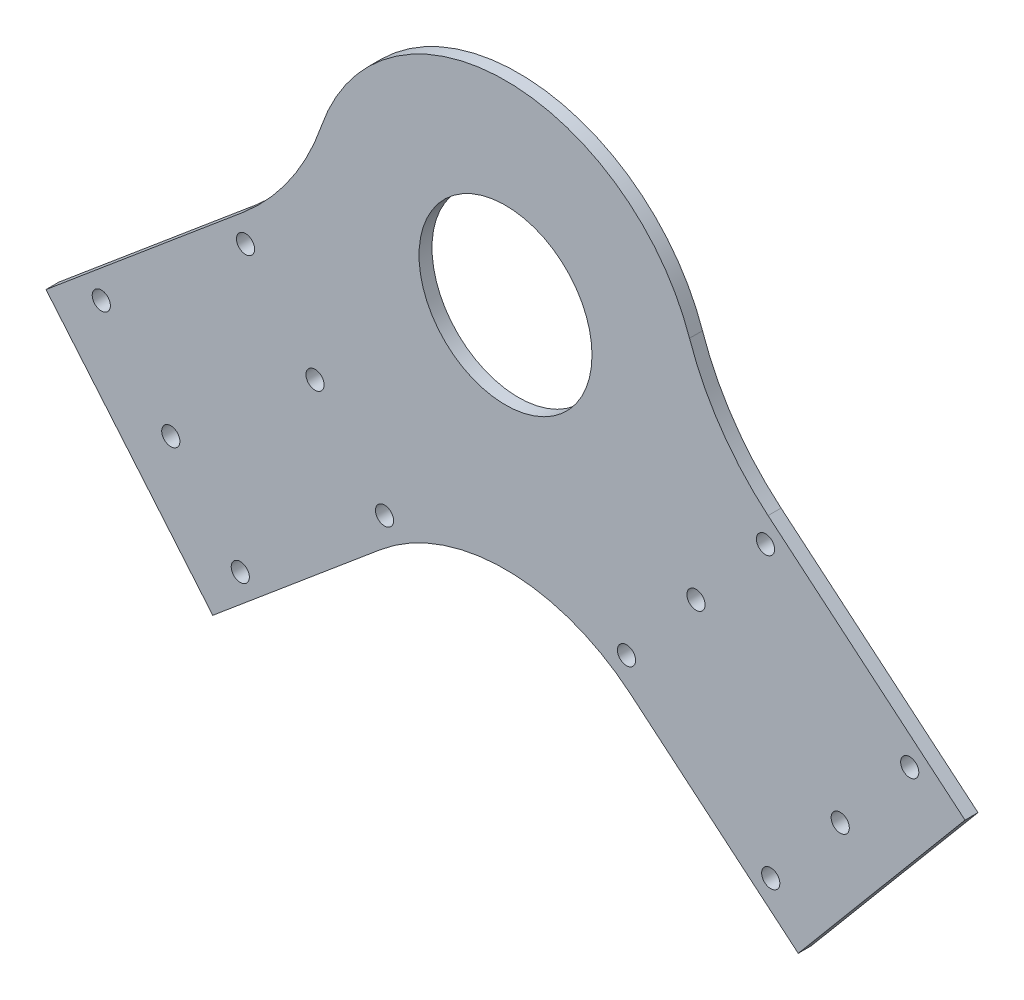
ISO-10303-21;
HEADER;
FILE_DESCRIPTION(('STEP AP214'),'2;1');
FILE_NAME('part.step','',(''),(''),'','','');
FILE_SCHEMA(('AUTOMOTIVE_DESIGN { 1 0 10303 214 1 1 1 1 }'));
ENDSEC;
DATA;
#1=APPLICATION_CONTEXT('core data for automotive mechanical design processes');
#2=APPLICATION_PROTOCOL_DEFINITION('international standard','automotive_design',2000,#1);
#3=PRODUCT_CONTEXT('',#1,'mechanical');
#4=PRODUCT('Part','Part','',(#3));
#5=PRODUCT_RELATED_PRODUCT_CATEGORY('part','',(#4));
#6=PRODUCT_DEFINITION_FORMATION('','',#4);
#7=PRODUCT_DEFINITION_CONTEXT('part definition',#1,'design');
#8=PRODUCT_DEFINITION('design','',#6,#7);
#9=PRODUCT_DEFINITION_SHAPE('','',#8);
#10=(LENGTH_UNIT() NAMED_UNIT(*) SI_UNIT(.MILLI.,.METRE.));
#11=(NAMED_UNIT(*) PLANE_ANGLE_UNIT() SI_UNIT($,.RADIAN.));
#12=(NAMED_UNIT(*) SI_UNIT($,.STERADIAN.) SOLID_ANGLE_UNIT());
#13=UNCERTAINTY_MEASURE_WITH_UNIT(LENGTH_MEASURE(1.E-05),#10,'distance_accuracy_value','');
#14=(GEOMETRIC_REPRESENTATION_CONTEXT(3) GLOBAL_UNCERTAINTY_ASSIGNED_CONTEXT((#13)) GLOBAL_UNIT_ASSIGNED_CONTEXT((#10,
#11,#12)) REPRESENTATION_CONTEXT('',''));
#15=CARTESIAN_POINT('',(0.,0.,0.));
#16=DIRECTION('',(0.,0.,1.));
#17=DIRECTION('',(1.,0.,0.));
#18=AXIS2_PLACEMENT_3D('',#15,#16,#17);
#19=CARTESIAN_POINT('',(0.,0.,3.));
#20=DIRECTION('',(0.,0.,-1.));
#21=DIRECTION('',(-1.,0.,0.));
#22=AXIS2_PLACEMENT_3D('',#19,#20,#21);
#23=CYLINDRICAL_SURFACE('',#22,45.);
#24=CARTESIAN_POINT('',(0.,0.,3.));
#25=DIRECTION('',(0.,0.,1.));
#26=DIRECTION('',(1.,0.,0.));
#27=AXIS2_PLACEMENT_3D('',#24,#25,#26);
#28=CIRCLE('',#27,45.);
#29=CARTESIAN_POINT('',(42.5490311383006,14.6485476820033,3.));
#30=VERTEX_POINT('',#29);
#31=CARTESIAN_POINT('',(-42.5490311383006,14.6485476820033,3.));
#32=VERTEX_POINT('',#31);
#33=EDGE_CURVE('E146',#30,#32,#28,.T.);
#34=ORIENTED_EDGE('',*,*,#33,.F.);
#35=DIRECTION('',(0.,0.,-1.));
#36=VECTOR('',#35,1.);
#37=CARTESIAN_POINT('',(42.5490311383006,14.6485476820033,3.));
#38=LINE('',#37,#36);
#39=CARTESIAN_POINT('',(42.5490311383006,14.6485476820033,0.));
#40=VERTEX_POINT('',#39);
#41=EDGE_CURVE('E259',#30,#40,#38,.T.);
#42=ORIENTED_EDGE('',*,*,#41,.T.);
#43=CARTESIAN_POINT('',(0.,0.,0.));
#44=DIRECTION('',(0.,0.,1.));
#45=DIRECTION('',(1.,0.,0.));
#46=AXIS2_PLACEMENT_3D('',#43,#44,#45);
#47=CIRCLE('',#46,45.);
#48=CARTESIAN_POINT('',(-42.5490311383006,14.6485476820033,0.));
#49=VERTEX_POINT('',#48);
#50=EDGE_CURVE('E201',#40,#49,#47,.T.);
#51=ORIENTED_EDGE('',*,*,#50,.T.);
#52=DIRECTION('',(0.,0.,-1.));
#53=VECTOR('',#52,1.);
#54=CARTESIAN_POINT('',(-42.5490311383006,14.6485476820033,3.));
#55=LINE('',#54,#53);
#56=EDGE_CURVE('E134',#49,#32,#55,.F.);
#57=ORIENTED_EDGE('',*,*,#56,.T.);
#58=EDGE_LOOP('',(#34,#42,#51,#57));
#59=FACE_BOUND('',#58,.T.);
#60=ADVANCED_FACE('F45',(#59),#23,.T.);
#61=CARTESIAN_POINT('',(-19.2836282905963,22.9813332935692,3.));
#62=DIRECTION('',(-0.642787609686544,0.766044443118974,0.));
#63=DIRECTION('',(-0.766044443118974,-0.642787609686544,0.));
#64=AXIS2_PLACEMENT_3D('',#61,#62,#63);
#65=PLANE('',#64);
#66=DIRECTION('',(0.766044443118974,0.642787609686544,0.));
#67=VECTOR('',#66,1.);
#68=CARTESIAN_POINT('',(-19.2836282905963,22.9813332935692,3.));
#69=LINE('',#68,#67);
#70=CARTESIAN_POINT('',(-106.261095469114,-50.0014273366601,3.));
#71=VERTEX_POINT('',#70);
#72=CARTESIAN_POINT('',(-60.7138160748421,-11.7827219957974,3.));
#73=VERTEX_POINT('',#72);
#74=EDGE_CURVE('E126',#71,#73,#69,.T.);
#75=ORIENTED_EDGE('',*,*,#74,.T.);
#76=DIRECTION('',(0.,0.,-1.));
#77=VECTOR('',#76,1.);
#78=CARTESIAN_POINT('',(-60.7138160748421,-11.7827219957974,3.));
#79=LINE('',#78,#77);
#80=CARTESIAN_POINT('',(-60.7138160748421,-11.7827219957974,0.));
#81=VERTEX_POINT('',#80);
#82=EDGE_CURVE('E264',#73,#81,#79,.T.);
#83=ORIENTED_EDGE('',*,*,#82,.T.);
#84=DIRECTION('',(0.766044443118974,0.642787609686544,0.));
#85=VECTOR('',#84,1.);
#86=CARTESIAN_POINT('',(-19.2836282905963,22.9813332935692,0.));
#87=LINE('',#86,#85);
#88=CARTESIAN_POINT('',(-106.261095469114,-50.0014273366601,0.));
#89=VERTEX_POINT('',#88);
#90=EDGE_CURVE('E129',#89,#81,#87,.T.);
#91=ORIENTED_EDGE('',*,*,#90,.F.);
#92=DIRECTION('',(0.,0.,-1.));
#93=VECTOR('',#92,1.);
#94=CARTESIAN_POINT('',(-106.261095469114,-50.0014273366601,3.));
#95=LINE('',#94,#93);
#96=EDGE_CURVE('E122',#71,#89,#95,.T.);
#97=ORIENTED_EDGE('',*,*,#96,.F.);
#98=EDGE_LOOP('',(#75,#83,#91,#97));
#99=FACE_BOUND('',#98,.T.);
#100=ADVANCED_FACE('F124',(#99),#65,.T.);
#101=CARTESIAN_POINT('',(-86.9774671785178,-72.9827606302294,3.));
#102=DIRECTION('',(-0.766044443118973,-0.642787609686545,0.));
#103=DIRECTION('',(0.642787609686545,-0.766044443118973,0.));
#104=AXIS2_PLACEMENT_3D('',#101,#102,#103);
#105=PLANE('',#104);
#106=DIRECTION('',(-0.642787609686545,0.766044443118973,0.));
#107=VECTOR('',#106,1.);
#108=CARTESIAN_POINT('',(-86.9774671785178,-72.9827606302294,0.));
#109=LINE('',#108,#107);
#110=CARTESIAN_POINT('',(-67.6938388879215,-95.9640939237985,0.));
#111=VERTEX_POINT('',#110);
#112=EDGE_CURVE('E205',#111,#89,#109,.T.);
#113=ORIENTED_EDGE('',*,*,#112,.F.);
#114=DIRECTION('',(0.,0.,-1.));
#115=VECTOR('',#114,1.);
#116=CARTESIAN_POINT('',(-67.6938388879215,-95.9640939237985,3.));
#117=LINE('',#116,#115);
#118=CARTESIAN_POINT('',(-67.6938388879215,-95.9640939237985,3.));
#119=VERTEX_POINT('',#118);
#120=EDGE_CURVE('E135',#119,#111,#117,.T.);
#121=ORIENTED_EDGE('',*,*,#120,.F.);
#122=DIRECTION('',(-0.642787609686545,0.766044443118973,0.));
#123=VECTOR('',#122,1.);
#124=CARTESIAN_POINT('',(-86.9774671785178,-72.9827606302294,3.));
#125=LINE('',#124,#123);
#126=EDGE_CURVE('E142',#119,#71,#125,.T.);
#127=ORIENTED_EDGE('',*,*,#126,.T.);
#128=ORIENTED_EDGE('',*,*,#96,.T.);
#129=EDGE_LOOP('',(#113,#121,#127,#128));
#130=FACE_BOUND('',#129,.T.);
#131=ADVANCED_FACE('F148',(#130),#105,.T.);
#132=CARTESIAN_POINT('',(19.2836282905963,-22.9813332935693,3.));
#133=DIRECTION('',(-0.642787609686543,0.766044443118975,0.));
#134=DIRECTION('',(-0.766044443118975,-0.642787609686543,0.));
#135=AXIS2_PLACEMENT_3D('',#132,#133,#134);
#136=PLANE('',#135);
#137=DIRECTION('',(0.766044443118975,0.642787609686543,0.));
#138=VECTOR('',#137,1.);
#139=CARTESIAN_POINT('',(19.2836282905963,-22.9813332935693,0.));
#140=LINE('',#139,#138);
#141=CARTESIAN_POINT('',(-28.9254424358944,-63.4335467595675,0.));
#142=VERTEX_POINT('',#141);
#143=EDGE_CURVE('E207',#111,#142,#140,.T.);
#144=ORIENTED_EDGE('',*,*,#143,.T.);
#145=DIRECTION('',(0.,0.,-1.));
#146=VECTOR('',#145,1.);
#147=CARTESIAN_POINT('',(-28.9254424358944,-63.4335467595675,3.));
#148=LINE('',#147,#146);
#149=CARTESIAN_POINT('',(-28.9254424358944,-63.4335467595675,3.));
#150=VERTEX_POINT('',#149);
#151=EDGE_CURVE('E60',#142,#150,#148,.F.);
#152=ORIENTED_EDGE('',*,*,#151,.T.);
#153=DIRECTION('',(0.766044443118975,0.642787609686543,0.));
#154=VECTOR('',#153,1.);
#155=CARTESIAN_POINT('',(19.2836282905963,-22.9813332935693,3.));
#156=LINE('',#155,#154);
#157=EDGE_CURVE('E149',#119,#150,#156,.T.);
#158=ORIENTED_EDGE('',*,*,#157,.F.);
#159=ORIENTED_EDGE('',*,*,#120,.T.);
#160=EDGE_LOOP('',(#144,#152,#158,#159));
#161=FACE_BOUND('',#160,.T.);
#162=ADVANCED_FACE('F342',(#161),#136,.F.);
#163=CARTESIAN_POINT('',(-19.2836282905963,-22.9813332935693,3.));
#164=DIRECTION('',(-0.642787609686543,-0.766044443118975,0.));
#165=DIRECTION('',(0.766044443118975,-0.642787609686543,0.));
#166=AXIS2_PLACEMENT_3D('',#163,#164,#165);
#167=PLANE('',#166);
#168=DIRECTION('',(-0.766044443118975,0.642787609686543,0.));
#169=VECTOR('',#168,1.);
#170=CARTESIAN_POINT('',(-19.2836282905963,-22.9813332935693,3.));
#171=LINE('',#170,#169);
#172=CARTESIAN_POINT('',(67.6938388879215,-95.9640939237985,3.));
#173=VERTEX_POINT('',#172);
#174=CARTESIAN_POINT('',(28.9254424358944,-63.4335467595675,3.));
#175=VERTEX_POINT('',#174);
#176=EDGE_CURVE('E151',#173,#175,#171,.T.);
#177=ORIENTED_EDGE('',*,*,#176,.T.);
#178=DIRECTION('',(0.,0.,-1.));
#179=VECTOR('',#178,1.);
#180=CARTESIAN_POINT('',(28.9254424358944,-63.4335467595675,3.));
#181=LINE('',#180,#179);
#182=CARTESIAN_POINT('',(28.9254424358944,-63.4335467595675,0.));
#183=VERTEX_POINT('',#182);
#184=EDGE_CURVE('E273',#175,#183,#181,.T.);
#185=ORIENTED_EDGE('',*,*,#184,.T.);
#186=DIRECTION('',(-0.766044443118975,0.642787609686543,0.));
#187=VECTOR('',#186,1.);
#188=CARTESIAN_POINT('',(-19.2836282905963,-22.9813332935693,0.));
#189=LINE('',#188,#187);
#190=CARTESIAN_POINT('',(67.6938388879215,-95.9640939237985,0.));
#191=VERTEX_POINT('',#190);
#192=EDGE_CURVE('E209',#191,#183,#189,.T.);
#193=ORIENTED_EDGE('',*,*,#192,.F.);
#194=DIRECTION('',(0.,0.,-1.));
#195=VECTOR('',#194,1.);
#196=CARTESIAN_POINT('',(67.6938388879215,-95.9640939237985,3.));
#197=LINE('',#196,#195);
#198=EDGE_CURVE('E255',#173,#191,#197,.T.);
#199=ORIENTED_EDGE('',*,*,#198,.F.);
#200=EDGE_LOOP('',(#177,#185,#193,#199));
#201=FACE_BOUND('',#200,.T.);
#202=ADVANCED_FACE('F279',(#201),#167,.T.);
#203=CARTESIAN_POINT('',(86.9774671785178,-72.9827606302294,3.));
#204=DIRECTION('',(-0.766044443118973,0.642787609686545,0.));
#205=DIRECTION('',(-0.642787609686545,-0.766044443118973,0.));
#206=AXIS2_PLACEMENT_3D('',#203,#204,#205);
#207=PLANE('',#206);
#208=DIRECTION('',(0.642787609686545,0.766044443118973,0.));
#209=VECTOR('',#208,1.);
#210=CARTESIAN_POINT('',(86.9774671785178,-72.9827606302294,0.));
#211=LINE('',#210,#209);
#212=CARTESIAN_POINT('',(106.261095469114,-50.0014273366601,0.));
#213=VERTEX_POINT('',#212);
#214=EDGE_CURVE('E211',#191,#213,#211,.T.);
#215=ORIENTED_EDGE('',*,*,#214,.T.);
#216=DIRECTION('',(0.,0.,-1.));
#217=VECTOR('',#216,1.);
#218=CARTESIAN_POINT('',(106.261095469114,-50.0014273366601,3.));
#219=LINE('',#218,#217);
#220=CARTESIAN_POINT('',(106.261095469114,-50.0014273366601,3.));
#221=VERTEX_POINT('',#220);
#222=EDGE_CURVE('E197',#221,#213,#219,.T.);
#223=ORIENTED_EDGE('',*,*,#222,.F.);
#224=DIRECTION('',(0.642787609686545,0.766044443118973,0.));
#225=VECTOR('',#224,1.);
#226=CARTESIAN_POINT('',(86.9774671785178,-72.9827606302294,3.));
#227=LINE('',#226,#225);
#228=EDGE_CURVE('E157',#173,#221,#227,.T.);
#229=ORIENTED_EDGE('',*,*,#228,.F.);
#230=ORIENTED_EDGE('',*,*,#198,.T.);
#231=EDGE_LOOP('',(#215,#223,#229,#230));
#232=FACE_BOUND('',#231,.T.);
#233=ADVANCED_FACE('F290',(#232),#207,.F.);
#234=CARTESIAN_POINT('',(77.4019116395307,-64.9479155091474,3.));
#235=DIRECTION('',(0.,0.,-1.));
#236=DIRECTION('',(-1.,0.,0.));
#237=AXIS2_PLACEMENT_3D('',#234,#235,#236);
#238=CYLINDRICAL_SURFACE('',#237,2.1);
#239=CARTESIAN_POINT('',(77.4019116395307,-64.9479155091474,3.));
#240=DIRECTION('',(0.,0.,1.));
#241=DIRECTION('',(1.,0.,0.));
#242=AXIS2_PLACEMENT_3D('',#239,#240,#241);
#243=CIRCLE('',#242,2.1);
#244=CARTESIAN_POINT('',(79.5019116395307,-64.9479155091474,3.));
#245=VERTEX_POINT('',#244);
#246=EDGE_CURVE('E191',#245,#245,#243,.T.);
#247=ORIENTED_EDGE('',*,*,#246,.T.);
#248=EDGE_LOOP('',(#247));
#249=FACE_BOUND('',#248,.T.);
#250=CARTESIAN_POINT('',(77.4019116395307,-64.9479155091474,0.));
#251=DIRECTION('',(0.,0.,1.));
#252=DIRECTION('',(1.,0.,0.));
#253=AXIS2_PLACEMENT_3D('',#250,#251,#252);
#254=CIRCLE('',#253,2.1);
#255=CARTESIAN_POINT('',(79.5019116395307,-64.9479155091474,0.));
#256=VERTEX_POINT('',#255);
#257=EDGE_CURVE('E246',#256,#256,#254,.T.);
#258=ORIENTED_EDGE('',*,*,#257,.F.);
#259=EDGE_LOOP('',(#258));
#260=FACE_BOUND('',#259,.T.);
#261=ADVANCED_FACE('F351',(#249,#260),#238,.F.);
#262=CARTESIAN_POINT('',(61.3322213973671,-84.0990265871218,3.));
#263=DIRECTION('',(0.,0.,-1.));
#264=DIRECTION('',(-1.,0.,0.));
#265=AXIS2_PLACEMENT_3D('',#262,#263,#264);
#266=CYLINDRICAL_SURFACE('',#265,2.1);
#267=CARTESIAN_POINT('',(61.3322213973671,-84.0990265871218,3.));
#268=DIRECTION('',(0.,0.,1.));
#269=DIRECTION('',(1.,0.,0.));
#270=AXIS2_PLACEMENT_3D('',#267,#268,#269);
#271=CIRCLE('',#270,2.1);
#272=CARTESIAN_POINT('',(63.4322213973671,-84.0990265871218,3.));
#273=VERTEX_POINT('',#272);
#274=EDGE_CURVE('E188',#273,#273,#271,.T.);
#275=ORIENTED_EDGE('',*,*,#274,.T.);
#276=EDGE_LOOP('',(#275));
#277=FACE_BOUND('',#276,.T.);
#278=CARTESIAN_POINT('',(61.3322213973671,-84.0990265871218,0.));
#279=DIRECTION('',(0.,0.,1.));
#280=DIRECTION('',(1.,0.,0.));
#281=AXIS2_PLACEMENT_3D('',#278,#279,#280);
#282=CIRCLE('',#281,2.1);
#283=CARTESIAN_POINT('',(63.4322213973671,-84.0990265871218,0.));
#284=VERTEX_POINT('',#283);
#285=EDGE_CURVE('E243',#284,#284,#282,.T.);
#286=ORIENTED_EDGE('',*,*,#285,.F.);
#287=EDGE_LOOP('',(#286));
#288=FACE_BOUND('',#287,.T.);
#289=ADVANCED_FACE('F389',(#277,#288),#266,.F.);
#290=CARTESIAN_POINT('',(60.1180268282942,-17.809831905421,3.));
#291=DIRECTION('',(0.,0.,-1.));
#292=DIRECTION('',(-1.,0.,0.));
#293=AXIS2_PLACEMENT_3D('',#290,#291,#292);
#294=CYLINDRICAL_SURFACE('',#293,2.1);
#295=CARTESIAN_POINT('',(60.1180268282942,-17.809831905421,3.));
#296=DIRECTION('',(0.,0.,1.));
#297=DIRECTION('',(1.,0.,0.));
#298=AXIS2_PLACEMENT_3D('',#295,#296,#297);
#299=CIRCLE('',#298,2.1);
#300=CARTESIAN_POINT('',(62.2180268282941,-17.809831905421,3.));
#301=VERTEX_POINT('',#300);
#302=EDGE_CURVE('E185',#301,#301,#299,.T.);
#303=ORIENTED_EDGE('',*,*,#302,.T.);
#304=EDGE_LOOP('',(#303));
#305=FACE_BOUND('',#304,.T.);
#306=CARTESIAN_POINT('',(60.1180268282942,-17.809831905421,0.));
#307=DIRECTION('',(0.,0.,1.));
#308=DIRECTION('',(1.,0.,0.));
#309=AXIS2_PLACEMENT_3D('',#306,#307,#308);
#310=CIRCLE('',#309,2.1);
#311=CARTESIAN_POINT('',(62.2180268282941,-17.809831905421,0.));
#312=VERTEX_POINT('',#311);
#313=EDGE_CURVE('E240',#312,#312,#310,.T.);
#314=ORIENTED_EDGE('',*,*,#313,.F.);
#315=EDGE_LOOP('',(#314));
#316=FACE_BOUND('',#315,.T.);
#317=ADVANCED_FACE('F385',(#305,#316),#294,.F.);
#318=CARTESIAN_POINT('',(44.0483365861306,-36.9609429833953,3.));
#319=DIRECTION('',(0.,0.,-1.));
#320=DIRECTION('',(-1.,0.,0.));
#321=AXIS2_PLACEMENT_3D('',#318,#319,#320);
#322=CYLINDRICAL_SURFACE('',#321,2.1);
#323=CARTESIAN_POINT('',(44.0483365861306,-36.9609429833953,3.));
#324=DIRECTION('',(0.,0.,1.));
#325=DIRECTION('',(1.,0.,0.));
#326=AXIS2_PLACEMENT_3D('',#323,#324,#325);
#327=CIRCLE('',#326,2.1);
#328=CARTESIAN_POINT('',(46.1483365861306,-36.9609429833953,3.));
#329=VERTEX_POINT('',#328);
#330=EDGE_CURVE('E182',#329,#329,#327,.T.);
#331=ORIENTED_EDGE('',*,*,#330,.T.);
#332=EDGE_LOOP('',(#331));
#333=FACE_BOUND('',#332,.T.);
#334=CARTESIAN_POINT('',(44.0483365861306,-36.9609429833953,0.));
#335=DIRECTION('',(0.,0.,1.));
#336=DIRECTION('',(1.,0.,0.));
#337=AXIS2_PLACEMENT_3D('',#334,#335,#336);
#338=CIRCLE('',#337,2.1);
#339=CARTESIAN_POINT('',(46.1483365861306,-36.9609429833953,0.));
#340=VERTEX_POINT('',#339);
#341=EDGE_CURVE('E237',#340,#340,#338,.T.);
#342=ORIENTED_EDGE('',*,*,#341,.F.);
#343=EDGE_LOOP('',(#342));
#344=FACE_BOUND('',#343,.T.);
#345=ADVANCED_FACE('F381',(#333,#344),#322,.F.);
#346=CARTESIAN_POINT('',(27.978646343967,-56.1120540613696,3.));
#347=DIRECTION('',(0.,0.,-1.));
#348=DIRECTION('',(-1.,0.,0.));
#349=AXIS2_PLACEMENT_3D('',#346,#347,#348);
#350=CYLINDRICAL_SURFACE('',#349,2.1);
#351=CARTESIAN_POINT('',(27.978646343967,-56.1120540613696,3.));
#352=DIRECTION('',(0.,0.,1.));
#353=DIRECTION('',(1.,0.,0.));
#354=AXIS2_PLACEMENT_3D('',#351,#352,#353);
#355=CIRCLE('',#354,2.1);
#356=CARTESIAN_POINT('',(30.078646343967,-56.1120540613696,3.));
#357=VERTEX_POINT('',#356);
#358=EDGE_CURVE('E179',#357,#357,#355,.T.);
#359=ORIENTED_EDGE('',*,*,#358,.T.);
#360=EDGE_LOOP('',(#359));
#361=FACE_BOUND('',#360,.T.);
#362=CARTESIAN_POINT('',(27.978646343967,-56.1120540613696,0.));
#363=DIRECTION('',(0.,0.,1.));
#364=DIRECTION('',(1.,0.,0.));
#365=AXIS2_PLACEMENT_3D('',#362,#363,#364);
#366=CIRCLE('',#365,2.1);
#367=CARTESIAN_POINT('',(30.078646343967,-56.1120540613696,0.));
#368=VERTEX_POINT('',#367);
#369=EDGE_CURVE('E234',#368,#368,#366,.T.);
#370=ORIENTED_EDGE('',*,*,#369,.F.);
#371=EDGE_LOOP('',(#370));
#372=FACE_BOUND('',#371,.T.);
#373=ADVANCED_FACE('F377',(#361,#372),#350,.F.);
#374=CARTESIAN_POINT('',(-60.1180268282942,-17.809831905421,3.));
#375=DIRECTION('',(0.,0.,-1.));
#376=DIRECTION('',(-1.,0.,0.));
#377=AXIS2_PLACEMENT_3D('',#374,#375,#376);
#378=CYLINDRICAL_SURFACE('',#377,2.1);
#379=CARTESIAN_POINT('',(-60.1180268282942,-17.809831905421,3.));
#380=DIRECTION('',(0.,0.,1.));
#381=DIRECTION('',(1.,0.,0.));
#382=AXIS2_PLACEMENT_3D('',#379,#380,#381);
#383=CIRCLE('',#382,2.1);
#384=CARTESIAN_POINT('',(-58.0180268282942,-17.809831905421,3.));
#385=VERTEX_POINT('',#384);
#386=EDGE_CURVE('E176',#385,#385,#383,.F.);
#387=ORIENTED_EDGE('',*,*,#386,.F.);
#388=EDGE_LOOP('',(#387));
#389=FACE_BOUND('',#388,.T.);
#390=CARTESIAN_POINT('',(-60.1180268282942,-17.809831905421,0.));
#391=DIRECTION('',(0.,0.,1.));
#392=DIRECTION('',(1.,0.,0.));
#393=AXIS2_PLACEMENT_3D('',#390,#391,#392);
#394=CIRCLE('',#393,2.1);
#395=CARTESIAN_POINT('',(-58.0180268282942,-17.809831905421,0.));
#396=VERTEX_POINT('',#395);
#397=EDGE_CURVE('E231',#396,#396,#394,.F.);
#398=ORIENTED_EDGE('',*,*,#397,.T.);
#399=EDGE_LOOP('',(#398));
#400=FACE_BOUND('',#399,.T.);
#401=ADVANCED_FACE('F373',(#389,#400),#378,.F.);
#402=CARTESIAN_POINT('',(-27.978646343967,-56.1120540613696,3.));
#403=DIRECTION('',(0.,0.,-1.));
#404=DIRECTION('',(-1.,0.,0.));
#405=AXIS2_PLACEMENT_3D('',#402,#403,#404);
#406=CYLINDRICAL_SURFACE('',#405,2.1);
#407=CARTESIAN_POINT('',(-27.978646343967,-56.1120540613696,3.));
#408=DIRECTION('',(0.,0.,1.));
#409=DIRECTION('',(1.,0.,0.));
#410=AXIS2_PLACEMENT_3D('',#407,#408,#409);
#411=CIRCLE('',#410,2.1);
#412=CARTESIAN_POINT('',(-25.878646343967,-56.1120540613696,3.));
#413=VERTEX_POINT('',#412);
#414=EDGE_CURVE('E173',#413,#413,#411,.F.);
#415=ORIENTED_EDGE('',*,*,#414,.F.);
#416=EDGE_LOOP('',(#415));
#417=FACE_BOUND('',#416,.T.);
#418=CARTESIAN_POINT('',(-27.978646343967,-56.1120540613696,0.));
#419=DIRECTION('',(0.,0.,1.));
#420=DIRECTION('',(1.,0.,0.));
#421=AXIS2_PLACEMENT_3D('',#418,#419,#420);
#422=CIRCLE('',#421,2.1);
#423=CARTESIAN_POINT('',(-25.878646343967,-56.1120540613696,0.));
#424=VERTEX_POINT('',#423);
#425=EDGE_CURVE('E228',#424,#424,#422,.F.);
#426=ORIENTED_EDGE('',*,*,#425,.T.);
#427=EDGE_LOOP('',(#426));
#428=FACE_BOUND('',#427,.T.);
#429=ADVANCED_FACE('F369',(#417,#428),#406,.F.);
#430=CARTESIAN_POINT('',(-77.4019116395307,-64.9479155091474,3.));
#431=DIRECTION('',(0.,0.,-1.));
#432=DIRECTION('',(-1.,0.,0.));
#433=AXIS2_PLACEMENT_3D('',#430,#431,#432);
#434=CYLINDRICAL_SURFACE('',#433,2.1);
#435=CARTESIAN_POINT('',(-77.4019116395307,-64.9479155091474,3.));
#436=DIRECTION('',(0.,0.,1.));
#437=DIRECTION('',(1.,0.,0.));
#438=AXIS2_PLACEMENT_3D('',#435,#436,#437);
#439=CIRCLE('',#438,2.1);
#440=CARTESIAN_POINT('',(-75.3019116395307,-64.9479155091474,3.));
#441=VERTEX_POINT('',#440);
#442=EDGE_CURVE('E170',#441,#441,#439,.F.);
#443=ORIENTED_EDGE('',*,*,#442,.F.);
#444=EDGE_LOOP('',(#443));
#445=FACE_BOUND('',#444,.T.);
#446=CARTESIAN_POINT('',(-77.4019116395307,-64.9479155091474,0.));
#447=DIRECTION('',(0.,0.,1.));
#448=DIRECTION('',(1.,0.,0.));
#449=AXIS2_PLACEMENT_3D('',#446,#447,#448);
#450=CIRCLE('',#449,2.1);
#451=CARTESIAN_POINT('',(-75.3019116395307,-64.9479155091474,0.));
#452=VERTEX_POINT('',#451);
#453=EDGE_CURVE('E225',#452,#452,#450,.F.);
#454=ORIENTED_EDGE('',*,*,#453,.T.);
#455=EDGE_LOOP('',(#454));
#456=FACE_BOUND('',#455,.T.);
#457=ADVANCED_FACE('F365',(#445,#456),#434,.F.);
#458=CARTESIAN_POINT('',(-61.3322213973671,-84.0990265871218,3.));
#459=DIRECTION('',(0.,0.,-1.));
#460=DIRECTION('',(-1.,0.,0.));
#461=AXIS2_PLACEMENT_3D('',#458,#459,#460);
#462=CYLINDRICAL_SURFACE('',#461,2.1);
#463=CARTESIAN_POINT('',(-61.3322213973671,-84.0990265871218,3.));
#464=DIRECTION('',(0.,0.,1.));
#465=DIRECTION('',(1.,0.,0.));
#466=AXIS2_PLACEMENT_3D('',#463,#464,#465);
#467=CIRCLE('',#466,2.1);
#468=CARTESIAN_POINT('',(-59.2322213973671,-84.0990265871218,3.));
#469=VERTEX_POINT('',#468);
#470=EDGE_CURVE('E167',#469,#469,#467,.F.);
#471=ORIENTED_EDGE('',*,*,#470,.F.);
#472=EDGE_LOOP('',(#471));
#473=FACE_BOUND('',#472,.T.);
#474=CARTESIAN_POINT('',(-61.3322213973671,-84.0990265871218,0.));
#475=DIRECTION('',(0.,0.,1.));
#476=DIRECTION('',(1.,0.,0.));
#477=AXIS2_PLACEMENT_3D('',#474,#475,#476);
#478=CIRCLE('',#477,2.1);
#479=CARTESIAN_POINT('',(-59.2322213973671,-84.0990265871218,0.));
#480=VERTEX_POINT('',#479);
#481=EDGE_CURVE('E222',#480,#480,#478,.F.);
#482=ORIENTED_EDGE('',*,*,#481,.T.);
#483=EDGE_LOOP('',(#482));
#484=FACE_BOUND('',#483,.T.);
#485=ADVANCED_FACE('F361',(#473,#484),#462,.F.);
#486=CARTESIAN_POINT('',(-93.4716018816943,-45.7968044311731,3.));
#487=DIRECTION('',(0.,0.,-1.));
#488=DIRECTION('',(-1.,0.,0.));
#489=AXIS2_PLACEMENT_3D('',#486,#487,#488);
#490=CYLINDRICAL_SURFACE('',#489,2.1);
#491=CARTESIAN_POINT('',(-93.4716018816943,-45.7968044311731,3.));
#492=DIRECTION('',(0.,0.,1.));
#493=DIRECTION('',(1.,0.,0.));
#494=AXIS2_PLACEMENT_3D('',#491,#492,#493);
#495=CIRCLE('',#494,2.1);
#496=CARTESIAN_POINT('',(-91.3716018816943,-45.7968044311731,3.));
#497=VERTEX_POINT('',#496);
#498=EDGE_CURVE('E164',#497,#497,#495,.F.);
#499=ORIENTED_EDGE('',*,*,#498,.F.);
#500=EDGE_LOOP('',(#499));
#501=FACE_BOUND('',#500,.T.);
#502=CARTESIAN_POINT('',(-93.4716018816943,-45.7968044311731,0.));
#503=DIRECTION('',(0.,0.,1.));
#504=DIRECTION('',(1.,0.,0.));
#505=AXIS2_PLACEMENT_3D('',#502,#503,#504);
#506=CIRCLE('',#505,2.1);
#507=CARTESIAN_POINT('',(-91.3716018816943,-45.7968044311731,0.));
#508=VERTEX_POINT('',#507);
#509=EDGE_CURVE('E219',#508,#508,#506,.F.);
#510=ORIENTED_EDGE('',*,*,#509,.T.);
#511=EDGE_LOOP('',(#510));
#512=FACE_BOUND('',#511,.T.);
#513=ADVANCED_FACE('F357',(#501,#512),#490,.F.);
#514=CARTESIAN_POINT('',(-44.0483365861306,-36.9609429833953,3.));
#515=DIRECTION('',(0.,0.,-1.));
#516=DIRECTION('',(-1.,0.,0.));
#517=AXIS2_PLACEMENT_3D('',#514,#515,#516);
#518=CYLINDRICAL_SURFACE('',#517,2.1);
#519=CARTESIAN_POINT('',(-44.0483365861306,-36.9609429833953,3.));
#520=DIRECTION('',(0.,0.,1.));
#521=DIRECTION('',(1.,0.,0.));
#522=AXIS2_PLACEMENT_3D('',#519,#520,#521);
#523=CIRCLE('',#522,2.1);
#524=CARTESIAN_POINT('',(-41.9483365861306,-36.9609429833953,3.));
#525=VERTEX_POINT('',#524);
#526=EDGE_CURVE('E161',#525,#525,#523,.F.);
#527=ORIENTED_EDGE('',*,*,#526,.F.);
#528=EDGE_LOOP('',(#527));
#529=FACE_BOUND('',#528,.T.);
#530=CARTESIAN_POINT('',(-44.0483365861306,-36.9609429833953,0.));
#531=DIRECTION('',(0.,0.,1.));
#532=DIRECTION('',(1.,0.,0.));
#533=AXIS2_PLACEMENT_3D('',#530,#531,#532);
#534=CIRCLE('',#533,2.1);
#535=CARTESIAN_POINT('',(-41.9483365861306,-36.9609429833953,0.));
#536=VERTEX_POINT('',#535);
#537=EDGE_CURVE('E216',#536,#536,#534,.F.);
#538=ORIENTED_EDGE('',*,*,#537,.T.);
#539=EDGE_LOOP('',(#538));
#540=FACE_BOUND('',#539,.T.);
#541=ADVANCED_FACE('F354',(#529,#540),#518,.F.);
#542=CARTESIAN_POINT('',(19.2836282905963,22.9813332935692,3.));
#543=DIRECTION('',(-0.642787609686544,-0.766044443118974,0.));
#544=DIRECTION('',(0.766044443118974,-0.642787609686544,0.));
#545=AXIS2_PLACEMENT_3D('',#542,#543,#544);
#546=PLANE('',#545);
#547=DIRECTION('',(-0.766044443118974,0.642787609686544,0.));
#548=VECTOR('',#547,1.);
#549=CARTESIAN_POINT('',(19.2836282905963,22.9813332935692,0.));
#550=LINE('',#549,#548);
#551=CARTESIAN_POINT('',(60.7138160748421,-11.7827219957974,0.));
#552=VERTEX_POINT('',#551);
#553=EDGE_CURVE('E213',#213,#552,#550,.T.);
#554=ORIENTED_EDGE('',*,*,#553,.T.);
#555=DIRECTION('',(0.,0.,1.));
#556=VECTOR('',#555,1.);
#557=CARTESIAN_POINT('',(60.7138160748421,-11.7827219957974,3.));
#558=LINE('',#557,#556);
#559=CARTESIAN_POINT('',(60.7138160748421,-11.7827219957974,3.));
#560=VERTEX_POINT('',#559);
#561=EDGE_CURVE('E262',#552,#560,#558,.T.);
#562=ORIENTED_EDGE('',*,*,#561,.T.);
#563=DIRECTION('',(-0.766044443118974,0.642787609686544,0.));
#564=VECTOR('',#563,1.);
#565=CARTESIAN_POINT('',(19.2836282905963,22.9813332935692,3.));
#566=LINE('',#565,#564);
#567=EDGE_CURVE('E159',#221,#560,#566,.T.);
#568=ORIENTED_EDGE('',*,*,#567,.F.);
#569=ORIENTED_EDGE('',*,*,#222,.T.);
#570=EDGE_LOOP('',(#554,#562,#568,#569));
#571=FACE_BOUND('',#570,.T.);
#572=ADVANCED_FACE('F294',(#571),#546,.F.);
#573=CARTESIAN_POINT('',(0.,0.,3.));
#574=DIRECTION('',(0.,0.,-1.));
#575=DIRECTION('',(-1.,0.,0.));
#576=AXIS2_PLACEMENT_3D('',#573,#574,#575);
#577=CYLINDRICAL_SURFACE('',#576,20.);
#578=CARTESIAN_POINT('',(0.,0.,3.));
#579=DIRECTION('',(0.,0.,1.));
#580=DIRECTION('',(1.,0.,0.));
#581=AXIS2_PLACEMENT_3D('',#578,#579,#580);
#582=CIRCLE('',#581,20.);
#583=CARTESIAN_POINT('',(20.,0.,3.));
#584=VERTEX_POINT('',#583);
#585=EDGE_CURVE('E252',#584,#584,#582,.T.);
#586=ORIENTED_EDGE('',*,*,#585,.T.);
#587=EDGE_LOOP('',(#586));
#588=FACE_BOUND('',#587,.T.);
#589=CARTESIAN_POINT('',(0.,0.,0.));
#590=DIRECTION('',(0.,0.,1.));
#591=DIRECTION('',(1.,0.,0.));
#592=AXIS2_PLACEMENT_3D('',#589,#590,#591);
#593=CIRCLE('',#592,20.);
#594=CARTESIAN_POINT('',(20.,0.,0.));
#595=VERTEX_POINT('',#594);
#596=EDGE_CURVE('E198',#595,#595,#593,.T.);
#597=ORIENTED_EDGE('',*,*,#596,.F.);
#598=EDGE_LOOP('',(#597));
#599=FACE_BOUND('',#598,.T.);
#600=ADVANCED_FACE('F309',(#588,#599),#577,.F.);
#601=CARTESIAN_POINT('',(93.4716018816943,-45.7968044311731,3.));
#602=DIRECTION('',(0.,0.,-1.));
#603=DIRECTION('',(-1.,0.,0.));
#604=AXIS2_PLACEMENT_3D('',#601,#602,#603);
#605=CYLINDRICAL_SURFACE('',#604,2.1);
#606=CARTESIAN_POINT('',(93.4716018816943,-45.7968044311731,3.));
#607=DIRECTION('',(0.,0.,1.));
#608=DIRECTION('',(1.,0.,0.));
#609=AXIS2_PLACEMENT_3D('',#606,#607,#608);
#610=CIRCLE('',#609,2.1);
#611=CARTESIAN_POINT('',(95.5716018816943,-45.7968044311731,3.));
#612=VERTEX_POINT('',#611);
#613=EDGE_CURVE('E194',#612,#612,#610,.T.);
#614=ORIENTED_EDGE('',*,*,#613,.T.);
#615=EDGE_LOOP('',(#614));
#616=FACE_BOUND('',#615,.T.);
#617=CARTESIAN_POINT('',(93.4716018816943,-45.7968044311731,0.));
#618=DIRECTION('',(0.,0.,1.));
#619=DIRECTION('',(1.,0.,0.));
#620=AXIS2_PLACEMENT_3D('',#617,#618,#619);
#621=CIRCLE('',#620,2.1);
#622=CARTESIAN_POINT('',(95.5716018816943,-45.7968044311731,0.));
#623=VERTEX_POINT('',#622);
#624=EDGE_CURVE('E249',#623,#623,#621,.T.);
#625=ORIENTED_EDGE('',*,*,#624,.F.);
#626=EDGE_LOOP('',(#625));
#627=FACE_BOUND('',#626,.T.);
#628=ADVANCED_FACE('F313',(#616,#627),#605,.F.);
#629=CARTESIAN_POINT('',(0.,0.,3.));
#630=DIRECTION('',(0.,0.,1.));
#631=DIRECTION('',(1.,0.,0.));
#632=AXIS2_PLACEMENT_3D('',#629,#630,#631);
#633=PLANE('',#632);
#634=ORIENTED_EDGE('',*,*,#585,.F.);
#635=EDGE_LOOP('',(#634));
#636=FACE_BOUND('',#635,.T.);
#637=ORIENTED_EDGE('',*,*,#567,.T.);
#638=CARTESIAN_POINT('',(99.2810726560348,34.179944591341,3.));
#639=DIRECTION('',(0.,0.,1.));
#640=DIRECTION('',(1.,0.,0.));
#641=AXIS2_PLACEMENT_3D('',#638,#639,#640);
#642=CIRCLE('',#641,60.);
#643=EDGE_CURVE('E268',#560,#30,#642,.F.);
#644=ORIENTED_EDGE('',*,*,#643,.T.);
#645=ORIENTED_EDGE('',*,*,#33,.T.);
#646=CARTESIAN_POINT('',(-99.2810726560348,34.179944591341,3.));
#647=DIRECTION('',(0.,0.,1.));
#648=DIRECTION('',(1.,0.,0.));
#649=AXIS2_PLACEMENT_3D('',#646,#647,#648);
#650=CIRCLE('',#649,60.);
#651=EDGE_CURVE('E145',#32,#73,#650,.F.);
#652=ORIENTED_EDGE('',*,*,#651,.T.);
#653=ORIENTED_EDGE('',*,*,#74,.F.);
#654=ORIENTED_EDGE('',*,*,#126,.F.);
#655=ORIENTED_EDGE('',*,*,#157,.T.);
#656=CARTESIAN_POINT('',(0.,-97.9055466999214,3.));
#657=DIRECTION('',(0.,0.,1.));
#658=DIRECTION('',(1.,0.,0.));
#659=AXIS2_PLACEMENT_3D('',#656,#657,#658);
#660=CIRCLE('',#659,45.);
#661=EDGE_CURVE('E11',#150,#175,#660,.F.);
#662=ORIENTED_EDGE('',*,*,#661,.T.);
#663=ORIENTED_EDGE('',*,*,#176,.F.);
#664=ORIENTED_EDGE('',*,*,#228,.T.);
#665=EDGE_LOOP('',(#637,#644,#645,#652,#653,#654,#655,#662,#663,#664));
#666=FACE_BOUND('',#665,.T.);
#667=ORIENTED_EDGE('',*,*,#526,.T.);
#668=EDGE_LOOP('',(#667));
#669=FACE_BOUND('',#668,.T.);
#670=ORIENTED_EDGE('',*,*,#498,.T.);
#671=EDGE_LOOP('',(#670));
#672=FACE_BOUND('',#671,.T.);
#673=ORIENTED_EDGE('',*,*,#470,.T.);
#674=EDGE_LOOP('',(#673));
#675=FACE_BOUND('',#674,.T.);
#676=ORIENTED_EDGE('',*,*,#442,.T.);
#677=EDGE_LOOP('',(#676));
#678=FACE_BOUND('',#677,.T.);
#679=ORIENTED_EDGE('',*,*,#414,.T.);
#680=EDGE_LOOP('',(#679));
#681=FACE_BOUND('',#680,.T.);
#682=ORIENTED_EDGE('',*,*,#386,.T.);
#683=EDGE_LOOP('',(#682));
#684=FACE_BOUND('',#683,.T.);
#685=ORIENTED_EDGE('',*,*,#358,.F.);
#686=EDGE_LOOP('',(#685));
#687=FACE_BOUND('',#686,.T.);
#688=ORIENTED_EDGE('',*,*,#330,.F.);
#689=EDGE_LOOP('',(#688));
#690=FACE_BOUND('',#689,.T.);
#691=ORIENTED_EDGE('',*,*,#302,.F.);
#692=EDGE_LOOP('',(#691));
#693=FACE_BOUND('',#692,.T.);
#694=ORIENTED_EDGE('',*,*,#274,.F.);
#695=EDGE_LOOP('',(#694));
#696=FACE_BOUND('',#695,.T.);
#697=ORIENTED_EDGE('',*,*,#246,.F.);
#698=EDGE_LOOP('',(#697));
#699=FACE_BOUND('',#698,.T.);
#700=ORIENTED_EDGE('',*,*,#613,.F.);
#701=EDGE_LOOP('',(#700));
#702=FACE_BOUND('',#701,.T.);
#703=ADVANCED_FACE('F140',(#636,#666,#669,#672,#675,#678,#681,#684,#687,#690,#693,#696,#699,
#702),#633,.T.);
#704=CARTESIAN_POINT('',(0.,0.,0.));
#705=DIRECTION('',(0.,0.,1.));
#706=DIRECTION('',(1.,0.,0.));
#707=AXIS2_PLACEMENT_3D('',#704,#705,#706);
#708=PLANE('',#707);
#709=ORIENTED_EDGE('',*,*,#596,.T.);
#710=EDGE_LOOP('',(#709));
#711=FACE_BOUND('',#710,.T.);
#712=ORIENTED_EDGE('',*,*,#50,.F.);
#713=CARTESIAN_POINT('',(99.2810726560348,34.179944591341,0.));
#714=DIRECTION('',(0.,0.,1.));
#715=DIRECTION('',(1.,0.,0.));
#716=AXIS2_PLACEMENT_3D('',#713,#714,#715);
#717=CIRCLE('',#716,60.);
#718=EDGE_CURVE('E266',#40,#552,#717,.T.);
#719=ORIENTED_EDGE('',*,*,#718,.T.);
#720=ORIENTED_EDGE('',*,*,#553,.F.);
#721=ORIENTED_EDGE('',*,*,#214,.F.);
#722=ORIENTED_EDGE('',*,*,#192,.T.);
#723=CARTESIAN_POINT('',(0.,-97.9055466999214,0.));
#724=DIRECTION('',(0.,0.,1.));
#725=DIRECTION('',(1.,0.,0.));
#726=AXIS2_PLACEMENT_3D('',#723,#724,#725);
#727=CIRCLE('',#726,45.);
#728=EDGE_CURVE('E53',#183,#142,#727,.T.);
#729=ORIENTED_EDGE('',*,*,#728,.T.);
#730=ORIENTED_EDGE('',*,*,#143,.F.);
#731=ORIENTED_EDGE('',*,*,#112,.T.);
#732=ORIENTED_EDGE('',*,*,#90,.T.);
#733=CARTESIAN_POINT('',(-99.2810726560348,34.179944591341,0.));
#734=DIRECTION('',(0.,0.,1.));
#735=DIRECTION('',(1.,0.,0.));
#736=AXIS2_PLACEMENT_3D('',#733,#734,#735);
#737=CIRCLE('',#736,60.);
#738=EDGE_CURVE('E270',#81,#49,#737,.T.);
#739=ORIENTED_EDGE('',*,*,#738,.T.);
#740=EDGE_LOOP('',(#712,#719,#720,#721,#722,#729,#730,#731,#732,#739));
#741=FACE_BOUND('',#740,.T.);
#742=ORIENTED_EDGE('',*,*,#537,.F.);
#743=EDGE_LOOP('',(#742));
#744=FACE_BOUND('',#743,.T.);
#745=ORIENTED_EDGE('',*,*,#509,.F.);
#746=EDGE_LOOP('',(#745));
#747=FACE_BOUND('',#746,.T.);
#748=ORIENTED_EDGE('',*,*,#481,.F.);
#749=EDGE_LOOP('',(#748));
#750=FACE_BOUND('',#749,.T.);
#751=ORIENTED_EDGE('',*,*,#453,.F.);
#752=EDGE_LOOP('',(#751));
#753=FACE_BOUND('',#752,.T.);
#754=ORIENTED_EDGE('',*,*,#425,.F.);
#755=EDGE_LOOP('',(#754));
#756=FACE_BOUND('',#755,.T.);
#757=ORIENTED_EDGE('',*,*,#397,.F.);
#758=EDGE_LOOP('',(#757));
#759=FACE_BOUND('',#758,.T.);
#760=ORIENTED_EDGE('',*,*,#369,.T.);
#761=EDGE_LOOP('',(#760));
#762=FACE_BOUND('',#761,.T.);
#763=ORIENTED_EDGE('',*,*,#341,.T.);
#764=EDGE_LOOP('',(#763));
#765=FACE_BOUND('',#764,.T.);
#766=ORIENTED_EDGE('',*,*,#313,.T.);
#767=EDGE_LOOP('',(#766));
#768=FACE_BOUND('',#767,.T.);
#769=ORIENTED_EDGE('',*,*,#285,.T.);
#770=EDGE_LOOP('',(#769));
#771=FACE_BOUND('',#770,.T.);
#772=ORIENTED_EDGE('',*,*,#257,.T.);
#773=EDGE_LOOP('',(#772));
#774=FACE_BOUND('',#773,.T.);
#775=ORIENTED_EDGE('',*,*,#624,.T.);
#776=EDGE_LOOP('',(#775));
#777=FACE_BOUND('',#776,.T.);
#778=ADVANCED_FACE('F285',(#711,#741,#744,#747,#750,#753,#756,#759,#762,#765,#768,#771,#774,
#777),#708,.F.);
#779=CARTESIAN_POINT('',(99.2810726560348,34.179944591341,3.));
#780=DIRECTION('',(0.,0.,-1.));
#781=DIRECTION('',(-1.,0.,0.));
#782=AXIS2_PLACEMENT_3D('',#779,#780,#781);
#783=CYLINDRICAL_SURFACE('',#782,60.);
#784=ORIENTED_EDGE('',*,*,#643,.F.);
#785=ORIENTED_EDGE('',*,*,#561,.F.);
#786=ORIENTED_EDGE('',*,*,#718,.F.);
#787=ORIENTED_EDGE('',*,*,#41,.F.);
#788=EDGE_LOOP('',(#784,#785,#786,#787));
#789=FACE_BOUND('',#788,.T.);
#790=ADVANCED_FACE('F300',(#789),#783,.F.);
#791=CARTESIAN_POINT('',(-99.2810726560348,34.179944591341,3.));
#792=DIRECTION('',(0.,0.,-1.));
#793=DIRECTION('',(-1.,0.,0.));
#794=AXIS2_PLACEMENT_3D('',#791,#792,#793);
#795=CYLINDRICAL_SURFACE('',#794,60.);
#796=ORIENTED_EDGE('',*,*,#651,.F.);
#797=ORIENTED_EDGE('',*,*,#56,.F.);
#798=ORIENTED_EDGE('',*,*,#738,.F.);
#799=ORIENTED_EDGE('',*,*,#82,.F.);
#800=EDGE_LOOP('',(#796,#797,#798,#799));
#801=FACE_BOUND('',#800,.T.);
#802=ADVANCED_FACE('F304',(#801),#795,.F.);
#803=CARTESIAN_POINT('',(0.,-97.9055466999214,3.));
#804=DIRECTION('',(0.,0.,-1.));
#805=DIRECTION('',(-1.,0.,0.));
#806=AXIS2_PLACEMENT_3D('',#803,#804,#805);
#807=CYLINDRICAL_SURFACE('',#806,45.);
#808=ORIENTED_EDGE('',*,*,#661,.F.);
#809=ORIENTED_EDGE('',*,*,#151,.F.);
#810=ORIENTED_EDGE('',*,*,#728,.F.);
#811=ORIENTED_EDGE('',*,*,#184,.F.);
#812=EDGE_LOOP('',(#808,#809,#810,#811));
#813=FACE_BOUND('',#812,.T.);
#814=ADVANCED_FACE('F47',(#813),#807,.F.);
#815=CLOSED_SHELL('',(#60,#100,#131,#162,#202,#233,#261,#289,#317,#345,#373,#401,#429,#457,#485,
#513,#541,#572,#600,#628,#703,#778,#790,#802,#814));
#816=MANIFOLD_SOLID_BREP('B2',#815);
#817=ADVANCED_BREP_SHAPE_REPRESENTATION('',(#18,#816),#14);
#818=SHAPE_DEFINITION_REPRESENTATION(#9,#817);
ENDSEC;
END-ISO-10303-21;
